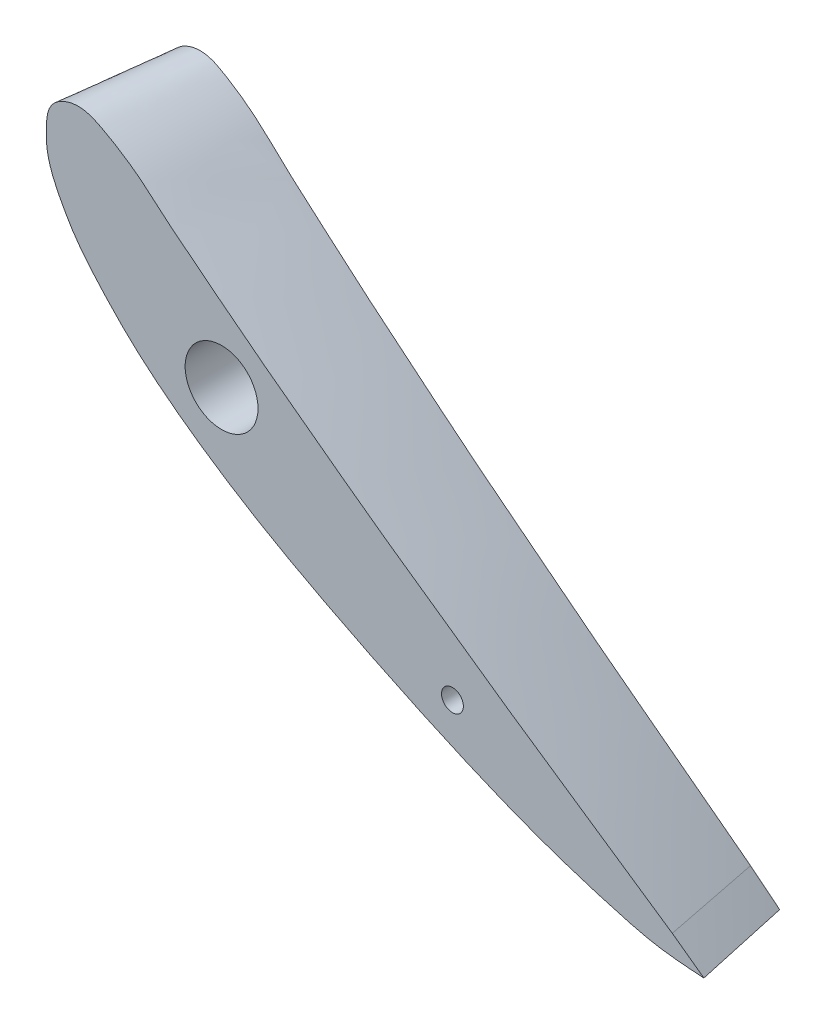
ISO-10303-21;
HEADER;
FILE_DESCRIPTION(('STEP AP214'),'2;1');
FILE_NAME('part.step','',(''),(''),'','','');
FILE_SCHEMA(('AUTOMOTIVE_DESIGN { 1 0 10303 214 1 1 1 1 }'));
ENDSEC;
DATA;
#1=APPLICATION_CONTEXT('core data for automotive mechanical design processes');
#2=APPLICATION_PROTOCOL_DEFINITION('international standard','automotive_design',2000,#1);
#3=PRODUCT_CONTEXT('',#1,'mechanical');
#4=PRODUCT('Part','Part','',(#3));
#5=PRODUCT_RELATED_PRODUCT_CATEGORY('part','',(#4));
#6=PRODUCT_DEFINITION_FORMATION('','',#4);
#7=PRODUCT_DEFINITION_CONTEXT('part definition',#1,'design');
#8=PRODUCT_DEFINITION('design','',#6,#7);
#9=PRODUCT_DEFINITION_SHAPE('','',#8);
#10=(LENGTH_UNIT() NAMED_UNIT(*) SI_UNIT(.MILLI.,.METRE.));
#11=(NAMED_UNIT(*) PLANE_ANGLE_UNIT() SI_UNIT($,.RADIAN.));
#12=(NAMED_UNIT(*) SI_UNIT($,.STERADIAN.) SOLID_ANGLE_UNIT());
#13=UNCERTAINTY_MEASURE_WITH_UNIT(LENGTH_MEASURE(1.E-05),#10,'distance_accuracy_value','');
#14=(GEOMETRIC_REPRESENTATION_CONTEXT(3) GLOBAL_UNCERTAINTY_ASSIGNED_CONTEXT((#13)) GLOBAL_UNIT_ASSIGNED_CONTEXT((#10,
#11,#12)) REPRESENTATION_CONTEXT('',''));
#15=CARTESIAN_POINT('',(0.,0.,0.));
#16=DIRECTION('',(0.,0.,1.));
#17=DIRECTION('',(1.,0.,0.));
#18=AXIS2_PLACEMENT_3D('',#15,#16,#17);
#19=CARTESIAN_POINT('',(-22.1711933751528,17.4064285533201,-15.));
#20=DIRECTION('',(0.,0.,1.));
#21=DIRECTION('',(1.,0.,0.));
#22=AXIS2_PLACEMENT_3D('',#19,#20,#21);
#23=PLANE('',#22);
#24=CARTESIAN_POINT('',(31.6897428885911,-21.3075758774188,-15.));
#25=DIRECTION('',(0.,0.,1.));
#26=DIRECTION('',(1.,0.,0.));
#27=AXIS2_PLACEMENT_3D('',#24,#25,#26);
#28=CIRCLE('',#27,1.5);
#29=CARTESIAN_POINT('',(33.1897428885911,-21.3075758774188,-15.));
#30=VERTEX_POINT('',#29);
#31=EDGE_CURVE('E85',#30,#30,#28,.T.);
#32=ORIENTED_EDGE('',*,*,#31,.T.);
#33=EDGE_LOOP('',(#32));
#34=FACE_BOUND('',#33,.T.);
#35=CARTESIAN_POINT('',(0.,0.,-15.));
#36=DIRECTION('',(0.,0.,1.));
#37=DIRECTION('',(1.,0.,0.));
#38=AXIS2_PLACEMENT_3D('',#35,#36,#37);
#39=CIRCLE('',#38,5.);
#40=CARTESIAN_POINT('',(5.,0.,-15.));
#41=VERTEX_POINT('',#40);
#42=EDGE_CURVE('E66',#41,#41,#39,.T.);
#43=ORIENTED_EDGE('',*,*,#42,.T.);
#44=EDGE_LOOP('',(#43));
#45=FACE_BOUND('',#44,.T.);
#46=CARTESIAN_POINT('',(57.6036750056897,-35.542429998651,-15.));
#47=CARTESIAN_POINT('',(56.2388977920127,-34.5074688290924,-15.));
#48=CARTESIAN_POINT('',(52.1445661509825,-31.4025853204187,-15.));
#49=CARTESIAN_POINT('',(45.3307585008602,-26.2147388286433,-15.));
#50=CARTESIAN_POINT('',(37.1067324226143,-20.0526071035048,-15.));
#51=CARTESIAN_POINT('',(29.0609366160996,-13.6617388149896,-15.));
#52=CARTESIAN_POINT('',(20.9169067344713,-7.39798040461272,-15.));
#53=CARTESIAN_POINT('',(12.9930323521428,-0.858716209414723,-15.));
#54=CARTESIAN_POINT('',(5.0582858099475,5.67038609166147,-15.));
#55=CARTESIAN_POINT('',(-1.37994875889341,11.3186071088783,-15.));
#56=CARTESIAN_POINT('',(-6.55409176600592,15.8203851997197,-15.));
#57=CARTESIAN_POINT('',(-9.57237805067181,18.8722758003235,-15.));
#58=CARTESIAN_POINT('',(-12.298789195959,20.976651583068,-15.));
#59=CARTESIAN_POINT('',(-14.4635519547526,22.3926177272927,-15.));
#60=CARTESIAN_POINT('',(-16.510186542221,23.5174604617983,-15.));
#61=CARTESIAN_POINT('',(-19.0350807988717,23.665473590377,-15.));
#62=CARTESIAN_POINT('',(-21.8604448995324,22.33963517474,-15.));
#63=CARTESIAN_POINT('',(-22.1349100172756,19.2815932305263,-15.));
#64=CARTESIAN_POINT('',(-22.2371773427754,16.5185153432735,-15.));
#65=CARTESIAN_POINT('',(-21.5273338612396,13.8353548334428,-15.));
#66=CARTESIAN_POINT('',(-20.2845397207269,11.1357407607872,-15.));
#67=CARTESIAN_POINT('',(-18.5798651776483,7.87909576155419,-15.));
#68=CARTESIAN_POINT('',(-15.8508439766193,4.35202984587507,-15.));
#69=CARTESIAN_POINT('',(-11.3474147710772,-0.934034012882321,-15.));
#70=CARTESIAN_POINT('',(-4.87029553469975,-6.64452599687584,-15.));
#71=CARTESIAN_POINT('',(3.4491751156533,-12.737304018546,-15.));
#72=CARTESIAN_POINT('',(12.2629555051353,-18.1725092001077,-15.));
#73=CARTESIAN_POINT('',(21.3285981876965,-23.2930852361814,-15.));
#74=CARTESIAN_POINT('',(30.6182219615916,-28.1713689973377,-15.));
#75=CARTESIAN_POINT('',(40.2405490728829,-32.7082606263667,-15.));
#76=CARTESIAN_POINT('',(48.6640657815466,-35.853082063981,-15.));
#77=CARTESIAN_POINT('',(55.790549096225,-38.1108965549288,-15.));
#78=CARTESIAN_POINT('',(59.6208137108184,-38.5437698429893,-15.));
#79=CARTESIAN_POINT('',(61.6010045224295,-38.7675590047992,-15.));
#80=B_SPLINE_CURVE_WITH_KNOTS('',3,(#46,#47,#48,#49,#50,#51,#52,#53,#54,#55,#56,#57,#58,#59,#60,
#61,#62,#63,#64,#65,#66,#67,#68,#69,#70,#71,#72,#73,#74,#75,#76,#77,#78,#79),.UNSPECIFIED.,.F.,
.F.,(4,1,1,1,1,1,1,1,1,1,1,1,1,1,1,1,1,1,1,1,1,1,1,1,1,1,1,1,1,1,1,4),(0.,0.024539223239315,
0.0736176697179449,0.122696116196575,0.171758102468826,0.220820088741077,0.269879113320182,
0.318936693489756,0.368025361597795,0.392583028094628,0.417173001250673,0.429440472758663,
0.441764658743505,0.454461371263475,0.461994015532278,0.477712656864197,0.492780517083889,
0.502278122505289,0.517831839222446,0.531656069899839,0.544957030128068,0.57036121074101,
0.595284183630096,0.644429948946362,0.693535769444944,0.742943262592495,0.792666042354747,
0.842690657547491,0.893260265870848,0.94491578158227,0.971522264346957,1.),.UNSPECIFIED.);
#81=CARTESIAN_POINT('',(57.6036750056897,-35.542429998651,-15.));
#82=VERTEX_POINT('',#81);
#83=CARTESIAN_POINT('',(61.6010045224295,-38.7675590047992,-15.));
#84=VERTEX_POINT('',#83);
#85=EDGE_CURVE('E61',#82,#84,#80,.T.);
#86=ORIENTED_EDGE('',*,*,#85,.F.);
#87=DIRECTION('',(-0.778272578096171,0.627926583434353,0.));
#88=VECTOR('',#87,1.);
#89=CARTESIAN_POINT('',(57.6036750056897,-35.542429998651,-15.));
#90=LINE('',#89,#88);
#91=EDGE_CURVE('E35',#84,#82,#90,.T.);
#92=ORIENTED_EDGE('',*,*,#91,.F.);
#93=EDGE_LOOP('',(#86,#92));
#94=FACE_BOUND('',#93,.T.);
#95=ADVANCED_FACE('F32',(#34,#45,#94),#23,.F.);
#96=CARTESIAN_POINT('',(-24.0107675203707,16.9470014810061,0.));
#97=DIRECTION('',(0.,0.,1.));
#98=DIRECTION('',(1.,0.,0.));
#99=AXIS2_PLACEMENT_3D('',#96,#97,#98);
#100=PLANE('',#99);
#101=CARTESIAN_POINT('',(31.6897428885911,-21.3075758774188,0.));
#102=DIRECTION('',(0.,0.,1.));
#103=DIRECTION('',(1.,0.,0.));
#104=AXIS2_PLACEMENT_3D('',#101,#102,#103);
#105=CIRCLE('',#104,1.5);
#106=CARTESIAN_POINT('',(33.1897428885911,-21.3075758774188,0.));
#107=VERTEX_POINT('',#106);
#108=EDGE_CURVE('E88',#107,#107,#105,.T.);
#109=ORIENTED_EDGE('',*,*,#108,.F.);
#110=EDGE_LOOP('',(#109));
#111=FACE_BOUND('',#110,.T.);
#112=CARTESIAN_POINT('',(0.,0.,0.));
#113=DIRECTION('',(0.,0.,1.));
#114=DIRECTION('',(1.,0.,0.));
#115=AXIS2_PLACEMENT_3D('',#112,#113,#114);
#116=CIRCLE('',#115,5.);
#117=CARTESIAN_POINT('',(5.,0.,0.));
#118=VERTEX_POINT('',#117);
#119=EDGE_CURVE('E82',#118,#118,#116,.T.);
#120=ORIENTED_EDGE('',*,*,#119,.F.);
#121=EDGE_LOOP('',(#120));
#122=FACE_BOUND('',#121,.T.);
#123=CARTESIAN_POINT('',(61.868833704388,-33.9492414141092,0.));
#124=CARTESIAN_POINT('',(60.3927587182459,-32.9440677163768,0.));
#125=CARTESIAN_POINT('',(55.9645337598205,-29.9285466231819,0.));
#126=CARTESIAN_POINT('',(48.5939604320893,-24.8885639730853,0.));
#127=CARTESIAN_POINT('',(39.7032187980151,-18.909001329102,0.));
#128=CARTESIAN_POINT('',(30.9859119367577,-12.6817951941061,0.));
#129=CARTESIAN_POINT('',(22.1730692745511,-6.59216260993577,0.));
#130=CARTESIAN_POINT('',(13.5748323520827,-0.20396020534763,0.));
#131=CARTESIAN_POINT('',(4.96581440972182,6.17308342153412,0.));
#132=CARTESIAN_POINT('',(-2.03814223882868,11.7123894473554,0.));
#133=CARTESIAN_POINT('',(-7.66494261812838,16.1250910446004,0.));
#134=CARTESIAN_POINT('',(-10.9699019673765,19.1425921626249,0.));
#135=CARTESIAN_POINT('',(-13.9206091189597,21.1889817668647,0.));
#136=CARTESIAN_POINT('',(-16.2499218012269,22.5483879741082,0.));
#137=CARTESIAN_POINT('',(-18.4407669591291,23.6109319545201,0.));
#138=CARTESIAN_POINT('',(-21.0777187386111,23.6309301454486,0.));
#139=CARTESIAN_POINT('',(-23.949248518026,22.1002942010044,0.));
#140=CARTESIAN_POINT('',(-24.0725960660568,18.9014761214317,0.));
#141=CARTESIAN_POINT('',(-24.0323082844689,16.0189415953341,0.));
#142=CARTESIAN_POINT('',(-23.1506414800944,13.2627619311373,0.));
#143=CARTESIAN_POINT('',(-21.7131566786579,10.5177601845058,0.));
#144=CARTESIAN_POINT('',(-19.7651413955332,7.21727566943067,0.));
#145=CARTESIAN_POINT('',(-16.7361428266371,3.68962430279513,0.));
#146=CARTESIAN_POINT('',(-11.7660731989215,-1.5753567339448,0.));
#147=CARTESIAN_POINT('',(-4.71831937673372,-7.17743790472392,0.));
#148=CARTESIAN_POINT('',(4.26812146292364,-13.0797147806775,0.));
#149=CARTESIAN_POINT('',(13.7343403321874,-18.2710248457323,0.));
#150=CARTESIAN_POINT('',(23.4461019393518,-23.1213429498701,0.));
#151=CARTESIAN_POINT('',(33.3782170591954,-27.7074721518719,0.));
#152=CARTESIAN_POINT('',(43.6386303791182,-31.9204476795489,0.));
#153=CARTESIAN_POINT('',(52.5768147709611,-34.7475874407676,0.));
#154=CARTESIAN_POINT('',(60.1173229513558,-36.7200147983291,0.));
#155=CARTESIAN_POINT('',(64.1286457620026,-36.9672869008036,0.));
#156=CARTESIAN_POINT('',(66.2024410141075,-37.0951229629449,0.));
#157=B_SPLINE_CURVE_WITH_KNOTS('',3,(#123,#124,#125,#126,#127,#128,#129,#130,#131,#132,#133,
#134,#135,#136,#137,#138,#139,#140,#141,#142,#143,#144,#145,#146,#147,#148,#149,#150,#151,#152,
#153,#154,#155,#156),.UNSPECIFIED.,.F.,.F.,(4,1,1,1,1,1,1,1,1,1,1,1,1,1,1,1,1,1,1,1,1,1,1,1,1,1,
1,1,1,1,1,4),(0.,0.024539223239315,0.0736176697179449,0.122696116196575,0.171758102468826,
0.220820088741077,0.269879113320182,0.318936693489756,0.368025361597795,0.392583028094628,
0.417173001250673,0.429440472758663,0.441764658743505,0.454461371263475,0.461994015532278,
0.477712656864197,0.492780517083889,0.502278122505289,0.517831839222446,0.531656069899839,
0.544957030128068,0.57036121074101,0.595284183630096,0.644429948946362,0.693535769444944,
0.742943262592495,0.792666042354747,0.842690657547491,0.893260265870848,0.94491578158227,
0.971522264346957,1.),.UNSPECIFIED.);
#158=CARTESIAN_POINT('',(61.868833704388,-33.9492414141092,0.));
#159=VERTEX_POINT('',#158);
#160=CARTESIAN_POINT('',(66.2024410141075,-37.0951229629449,0.));
#161=VERTEX_POINT('',#160);
#162=EDGE_CURVE('E41',#159,#161,#157,.T.);
#163=ORIENTED_EDGE('',*,*,#162,.T.);
#164=DIRECTION('',(-0.809253887239892,0.587459058988049,0.));
#165=VECTOR('',#164,1.);
#166=CARTESIAN_POINT('',(66.2024410141075,-37.0951229629449,0.));
#167=LINE('',#166,#165);
#168=EDGE_CURVE('E11',#161,#159,#167,.T.);
#169=ORIENTED_EDGE('',*,*,#168,.T.);
#170=EDGE_LOOP('',(#163,#169));
#171=FACE_BOUND('',#170,.T.);
#172=ADVANCED_FACE('F103',(#111,#122,#171),#100,.T.);
#173=CARTESIAN_POINT('',(66.2024410141075,-37.0951229629449,0.));
#174=CARTESIAN_POINT('',(61.6010045224295,-38.7675590047992,-15.));
#175=CARTESIAN_POINT('',(64.1286457620026,-36.9672869008036,0.));
#176=CARTESIAN_POINT('',(59.6208137108184,-38.5437698429893,-15.));
#177=CARTESIAN_POINT('',(60.1173229513558,-36.7200147983291,0.));
#178=CARTESIAN_POINT('',(55.790549096225,-38.1108965549288,-15.));
#179=CARTESIAN_POINT('',(52.5768147709611,-34.7475874407676,0.));
#180=CARTESIAN_POINT('',(48.6640657815466,-35.853082063981,-15.));
#181=CARTESIAN_POINT('',(43.6386303791182,-31.9204476795489,0.));
#182=CARTESIAN_POINT('',(40.2405490728829,-32.7082606263667,-15.));
#183=CARTESIAN_POINT('',(33.3782170591954,-27.7074721518719,0.));
#184=CARTESIAN_POINT('',(30.6182219615916,-28.1713689973377,-15.));
#185=CARTESIAN_POINT('',(23.4461019393518,-23.1213429498701,0.));
#186=CARTESIAN_POINT('',(21.3285981876965,-23.2930852361814,-15.));
#187=CARTESIAN_POINT('',(13.7343403321874,-18.2710248457323,0.));
#188=CARTESIAN_POINT('',(12.2629555051353,-18.1725092001077,-15.));
#189=CARTESIAN_POINT('',(4.26812146292364,-13.0797147806775,0.));
#190=CARTESIAN_POINT('',(3.4491751156533,-12.737304018546,-15.));
#191=CARTESIAN_POINT('',(-4.71831937673372,-7.17743790472392,0.));
#192=CARTESIAN_POINT('',(-4.87029553469975,-6.64452599687584,-15.));
#193=CARTESIAN_POINT('',(-11.7660731989215,-1.5753567339448,0.));
#194=CARTESIAN_POINT('',(-11.3474147710772,-0.934034012882321,-15.));
#195=CARTESIAN_POINT('',(-16.7361428266371,3.68962430279513,0.));
#196=CARTESIAN_POINT('',(-15.8508439766193,4.35202984587507,-15.));
#197=CARTESIAN_POINT('',(-19.7651413955332,7.21727566943067,0.));
#198=CARTESIAN_POINT('',(-18.5798651776483,7.87909576155419,-15.));
#199=CARTESIAN_POINT('',(-21.7131566786579,10.5177601845058,0.));
#200=CARTESIAN_POINT('',(-20.2845397207269,11.1357407607872,-15.));
#201=CARTESIAN_POINT('',(-23.1506414800944,13.2627619311373,0.));
#202=CARTESIAN_POINT('',(-21.5273338612396,13.8353548334428,-15.));
#203=CARTESIAN_POINT('',(-24.0323082844689,16.0189415953341,0.));
#204=CARTESIAN_POINT('',(-22.2371773427754,16.5185153432735,-15.));
#205=CARTESIAN_POINT('',(-24.0725960660568,18.9014761214317,0.));
#206=CARTESIAN_POINT('',(-22.1349100172756,19.2815932305263,-15.));
#207=CARTESIAN_POINT('',(-23.949248518026,22.1002942010044,0.));
#208=CARTESIAN_POINT('',(-21.8604448995324,22.33963517474,-15.));
#209=CARTESIAN_POINT('',(-21.0777187386111,23.6309301454486,0.));
#210=CARTESIAN_POINT('',(-19.0350807988717,23.665473590377,-15.));
#211=CARTESIAN_POINT('',(-18.4407669591291,23.6109319545201,0.));
#212=CARTESIAN_POINT('',(-16.510186542221,23.5174604617983,-15.));
#213=CARTESIAN_POINT('',(-16.2499218012269,22.5483879741082,0.));
#214=CARTESIAN_POINT('',(-14.4635519547526,22.3926177272927,-15.));
#215=CARTESIAN_POINT('',(-13.9206091189597,21.1889817668647,0.));
#216=CARTESIAN_POINT('',(-12.298789195959,20.976651583068,-15.));
#217=CARTESIAN_POINT('',(-10.9699019673765,19.1425921626249,0.));
#218=CARTESIAN_POINT('',(-9.57237805067181,18.8722758003235,-15.));
#219=CARTESIAN_POINT('',(-7.66494261812838,16.1250910446004,0.));
#220=CARTESIAN_POINT('',(-6.55409176600592,15.8203851997197,-15.));
#221=CARTESIAN_POINT('',(-2.03814223882868,11.7123894473554,0.));
#222=CARTESIAN_POINT('',(-1.37994875889341,11.3186071088783,-15.));
#223=CARTESIAN_POINT('',(4.96581440972182,6.17308342153412,0.));
#224=CARTESIAN_POINT('',(5.0582858099475,5.67038609166147,-15.));
#225=CARTESIAN_POINT('',(13.5748323520827,-0.20396020534763,0.));
#226=CARTESIAN_POINT('',(12.9930323521428,-0.858716209414723,-15.));
#227=CARTESIAN_POINT('',(22.1730692745511,-6.59216260993577,0.));
#228=CARTESIAN_POINT('',(20.9169067344713,-7.39798040461272,-15.));
#229=CARTESIAN_POINT('',(30.9859119367577,-12.6817951941061,0.));
#230=CARTESIAN_POINT('',(29.0609366160996,-13.6617388149896,-15.));
#231=CARTESIAN_POINT('',(39.7032187980151,-18.909001329102,0.));
#232=CARTESIAN_POINT('',(37.1067324226143,-20.0526071035048,-15.));
#233=CARTESIAN_POINT('',(48.5939604320893,-24.8885639730853,0.));
#234=CARTESIAN_POINT('',(45.3307585008602,-26.2147388286433,-15.));
#235=CARTESIAN_POINT('',(55.9645337598205,-29.9285466231819,0.));
#236=CARTESIAN_POINT('',(52.1445661509825,-31.4025853204187,-15.));
#237=CARTESIAN_POINT('',(60.3927587182459,-32.9440677163768,0.));
#238=CARTESIAN_POINT('',(56.2388977920127,-34.5074688290924,-15.));
#239=CARTESIAN_POINT('',(61.868833704388,-33.9492414141092,0.));
#240=CARTESIAN_POINT('',(57.6036750056897,-35.542429998651,-15.));
#241=B_SPLINE_SURFACE_WITH_KNOTS('',3,1,((#173,#174),(#175,#176),(#177,#178),(#179,#180),(#181,
#182),(#183,#184),(#185,#186),(#187,#188),(#189,#190),(#191,#192),(#193,#194),(#195,#196),(#197,
#198),(#199,#200),(#201,#202),(#203,#204),(#205,#206),(#207,#208),(#209,#210),(#211,#212),(#213,
#214),(#215,#216),(#217,#218),(#219,#220),(#221,#222),(#223,#224),(#225,#226),(#227,#228),(#229,
#230),(#231,#232),(#233,#234),(#235,#236),(#237,#238),(#239,#240)),.UNSPECIFIED.,.F.,.F.,.F.,(4,
1,1,1,1,1,1,1,1,1,1,1,1,1,1,1,1,1,1,1,1,1,1,1,1,1,1,1,1,1,1,4),(2,2),(0.,0.0284777356530428,
0.05508421841773,0.106739734129152,0.157309342452509,0.207333957645253,0.257056737407505,
0.306464230555056,0.355570051053638,0.404715816369904,0.42963878925899,0.455042969871932,
0.468343930100161,0.482168160777554,0.497721877494711,0.507219482916111,0.522287343135803,
0.538005984467722,0.545538628736525,0.558235341256495,0.570559527241337,0.582826998749327,
0.607416971905372,0.631974638402205,0.681063306510244,0.730120886679818,0.779179911258923,
0.828241897531174,0.877303883803425,0.926382330282055,0.975460776760685,1.),(0.,1.),.UNSPECIFIED.);
#242=DIRECTION('',(-0.272086037727438,-0.101633819499583,-0.956890670248022));
#243=VECTOR('',#242,1.);
#244=CARTESIAN_POINT('',(59.7362543550388,-34.7458357063801,-7.5));
#245=LINE('',#244,#243);
#246=EDGE_CURVE('E56',#159,#82,#245,.T.);
#247=DIRECTION('',(0.291621604977655,0.105992657647262,0.950643148628931));
#248=VECTOR('',#247,1.);
#249=CARTESIAN_POINT('',(63.9017227682685,-37.931340983872,-7.5));
#250=LINE('',#249,#248);
#251=EDGE_CURVE('E64',#84,#161,#250,.T.);
#252=ORIENTED_EDGE('',*,*,#162,.F.);
#253=ORIENTED_EDGE('',*,*,#246,.T.);
#254=ORIENTED_EDGE('',*,*,#85,.T.);
#255=ORIENTED_EDGE('',*,*,#251,.T.);
#256=EDGE_LOOP('',(#252,#253,#254,#255));
#257=FACE_BOUND('',#256,.T.);
#258=ADVANCED_FACE('F65',(#257),#241,.T.);
#259=CARTESIAN_POINT('',(61.868833704388,-33.9492414141092,0.));
#260=CARTESIAN_POINT('',(57.6036750056897,-35.542429998651,-15.));
#261=CARTESIAN_POINT('',(62.5911015893412,-34.4735550055818,0.));
#262=CARTESIAN_POINT('',(58.269896591813,-36.0799514996757,-15.));
#263=CARTESIAN_POINT('',(63.3133694742944,-34.9978685970544,0.));
#264=CARTESIAN_POINT('',(58.9361181779362,-36.6174730007004,-15.));
#265=CARTESIAN_POINT('',(64.7579052442009,-36.0464957799996,0.));
#266=CARTESIAN_POINT('',(60.2685613501828,-37.6925160027498,-15.));
#267=CARTESIAN_POINT('',(65.4801731291542,-36.5708093714722,0.));
#268=CARTESIAN_POINT('',(60.9347829363061,-38.2300375037745,-15.));
#269=CARTESIAN_POINT('',(66.2024410141075,-37.0951229629449,0.));
#270=CARTESIAN_POINT('',(61.6010045224295,-38.7675590047992,-15.));
#271=B_SPLINE_SURFACE_WITH_KNOTS('',3,1,((#259,#260),(#261,#262),(#263,#264),(#265,#266),(#267,
#268),(#269,#270)),.UNSPECIFIED.,.F.,.F.,.F.,(4,2,4),(2,2),(0.,0.5,1.),(0.,1.),.UNSPECIFIED.);
#272=ORIENTED_EDGE('',*,*,#168,.F.);
#273=ORIENTED_EDGE('',*,*,#251,.F.);
#274=ORIENTED_EDGE('',*,*,#91,.T.);
#275=ORIENTED_EDGE('',*,*,#246,.F.);
#276=EDGE_LOOP('',(#272,#273,#274,#275));
#277=FACE_BOUND('',#276,.T.);
#278=ADVANCED_FACE('F67',(#277),#271,.T.);
#279=CARTESIAN_POINT('',(0.,0.,-15.));
#280=DIRECTION('',(0.,0.,1.));
#281=DIRECTION('',(1.,0.,0.));
#282=AXIS2_PLACEMENT_3D('',#279,#280,#281);
#283=CYLINDRICAL_SURFACE('',#282,5.);
#284=ORIENTED_EDGE('',*,*,#42,.F.);
#285=EDGE_LOOP('',(#284));
#286=FACE_BOUND('',#285,.T.);
#287=ORIENTED_EDGE('',*,*,#119,.T.);
#288=EDGE_LOOP('',(#287));
#289=FACE_BOUND('',#288,.T.);
#290=ADVANCED_FACE('F99',(#286,#289),#283,.F.);
#291=CARTESIAN_POINT('',(31.6897428885911,-21.3075758774188,-15.));
#292=DIRECTION('',(0.,0.,1.));
#293=DIRECTION('',(1.,0.,0.));
#294=AXIS2_PLACEMENT_3D('',#291,#292,#293);
#295=CYLINDRICAL_SURFACE('',#294,1.5);
#296=ORIENTED_EDGE('',*,*,#31,.F.);
#297=EDGE_LOOP('',(#296));
#298=FACE_BOUND('',#297,.T.);
#299=ORIENTED_EDGE('',*,*,#108,.T.);
#300=EDGE_LOOP('',(#299));
#301=FACE_BOUND('',#300,.T.);
#302=ADVANCED_FACE('F96',(#298,#301),#295,.F.);
#303=CLOSED_SHELL('',(#95,#172,#258,#278,#290,#302));
#304=MANIFOLD_SOLID_BREP('B2',#303);
#305=ADVANCED_BREP_SHAPE_REPRESENTATION('',(#18,#304),#14);
#306=SHAPE_DEFINITION_REPRESENTATION(#9,#305);
ENDSEC;
END-ISO-10303-21;
